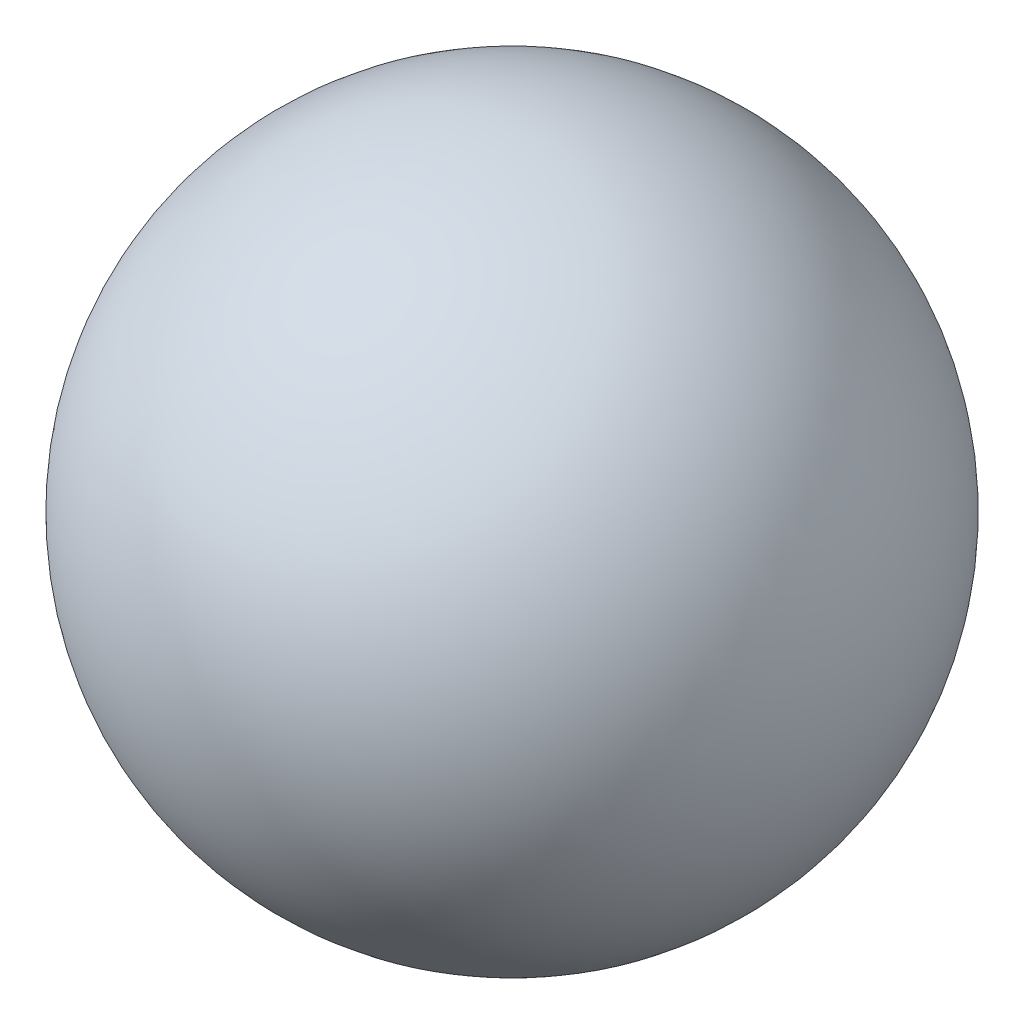
ISO-10303-21;
HEADER;
FILE_DESCRIPTION(('STEP AP214'),'2;1');
FILE_NAME('part.step','',(''),(''),'','','');
FILE_SCHEMA(('AUTOMOTIVE_DESIGN { 1 0 10303 214 1 1 1 1 }'));
ENDSEC;
DATA;
#1=APPLICATION_CONTEXT('core data for automotive mechanical design processes');
#2=APPLICATION_PROTOCOL_DEFINITION('international standard','automotive_design',2000,#1);
#3=PRODUCT_CONTEXT('',#1,'mechanical');
#4=PRODUCT('Part','Part','',(#3));
#5=PRODUCT_RELATED_PRODUCT_CATEGORY('part','',(#4));
#6=PRODUCT_DEFINITION_FORMATION('','',#4);
#7=PRODUCT_DEFINITION_CONTEXT('part definition',#1,'design');
#8=PRODUCT_DEFINITION('design','',#6,#7);
#9=PRODUCT_DEFINITION_SHAPE('','',#8);
#10=(LENGTH_UNIT() NAMED_UNIT(*) SI_UNIT(.MILLI.,.METRE.));
#11=(NAMED_UNIT(*) PLANE_ANGLE_UNIT() SI_UNIT($,.RADIAN.));
#12=(NAMED_UNIT(*) SI_UNIT($,.STERADIAN.) SOLID_ANGLE_UNIT());
#13=UNCERTAINTY_MEASURE_WITH_UNIT(LENGTH_MEASURE(1.E-05),#10,'distance_accuracy_value','');
#14=(GEOMETRIC_REPRESENTATION_CONTEXT(3) GLOBAL_UNCERTAINTY_ASSIGNED_CONTEXT((#13)) GLOBAL_UNIT_ASSIGNED_CONTEXT((#10,
#11,#12)) REPRESENTATION_CONTEXT('',''));
#15=CARTESIAN_POINT('',(0.,0.,0.));
#16=DIRECTION('',(0.,0.,1.));
#17=DIRECTION('',(1.,0.,0.));
#18=AXIS2_PLACEMENT_3D('',#15,#16,#17);
#19=CARTESIAN_POINT('',(0.,0.,0.));
#20=DIRECTION('',(0.,1.,0.));
#21=DIRECTION('',(-1.,0.,0.));
#22=AXIS2_PLACEMENT_3D('',#19,#20,#21);
#23=SPHERICAL_SURFACE('',#22,4.7625);
#24=CARTESIAN_POINT('',(0.,4.7625,0.));
#25=VERTEX_POINT('',#24);
#26=VERTEX_LOOP('',#25);
#27=FACE_BOUND('',#26,.T.);
#28=ADVANCED_FACE('F32',(#27),#23,.T.);
#29=CLOSED_SHELL('',(#28));
#30=MANIFOLD_SOLID_BREP('B2',#29);
#31=ADVANCED_BREP_SHAPE_REPRESENTATION('',(#18,#30),#14);
#32=SHAPE_DEFINITION_REPRESENTATION(#9,#31);
ENDSEC;
END-ISO-10303-21;
